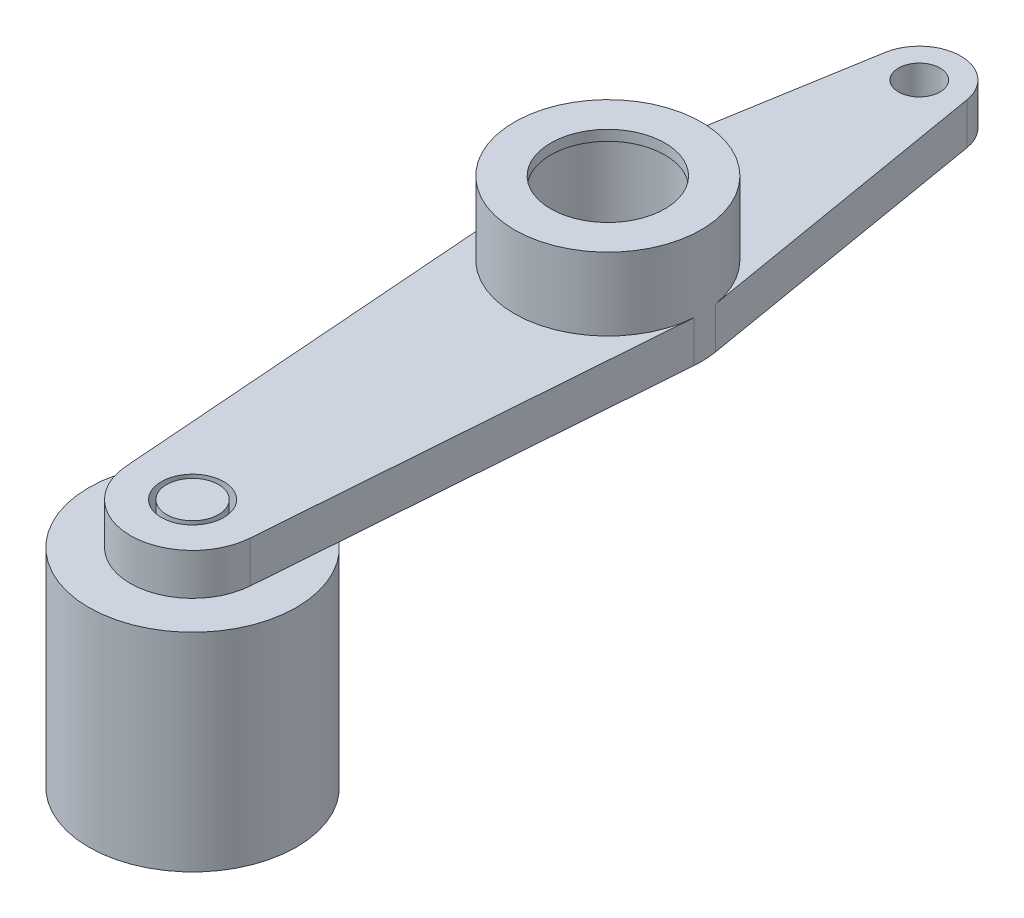
ISO-10303-21;
HEADER;
FILE_DESCRIPTION(('STEP AP214'),'2;1');
FILE_NAME('part.step','',(''),(''),'','','');
FILE_SCHEMA(('AUTOMOTIVE_DESIGN { 1 0 10303 214 1 1 1 1 }'));
ENDSEC;
DATA;
#1=APPLICATION_CONTEXT('core data for automotive mechanical design processes');
#2=APPLICATION_PROTOCOL_DEFINITION('international standard','automotive_design',2000,#1);
#3=PRODUCT_CONTEXT('',#1,'mechanical');
#4=PRODUCT('Part','Part','',(#3));
#5=PRODUCT_RELATED_PRODUCT_CATEGORY('part','',(#4));
#6=PRODUCT_DEFINITION_FORMATION('','',#4);
#7=PRODUCT_DEFINITION_CONTEXT('part definition',#1,'design');
#8=PRODUCT_DEFINITION('design','',#6,#7);
#9=PRODUCT_DEFINITION_SHAPE('','',#8);
#10=(LENGTH_UNIT() NAMED_UNIT(*) SI_UNIT(.MILLI.,.METRE.));
#11=(NAMED_UNIT(*) PLANE_ANGLE_UNIT() SI_UNIT($,.RADIAN.));
#12=(NAMED_UNIT(*) SI_UNIT($,.STERADIAN.) SOLID_ANGLE_UNIT());
#13=UNCERTAINTY_MEASURE_WITH_UNIT(LENGTH_MEASURE(1.E-05),#10,'distance_accuracy_value','');
#14=(GEOMETRIC_REPRESENTATION_CONTEXT(3) GLOBAL_UNCERTAINTY_ASSIGNED_CONTEXT((#13)) GLOBAL_UNIT_ASSIGNED_CONTEXT((#10,
#11,#12)) REPRESENTATION_CONTEXT('',''));
#15=CARTESIAN_POINT('',(0.,0.,0.));
#16=DIRECTION('',(0.,0.,1.));
#17=DIRECTION('',(1.,0.,0.));
#18=AXIS2_PLACEMENT_3D('',#15,#16,#17);
#19=CARTESIAN_POINT('',(0.,-43.1889152644782,74.1245546768149));
#20=DIRECTION('',(0.,-1.,0.));
#21=DIRECTION('',(0.,0.,-1.));
#22=AXIS2_PLACEMENT_3D('',#19,#20,#21);
#23=PLANE('',#22);
#24=CARTESIAN_POINT('',(0.,-43.1889152644782,74.1245546768149));
#25=DIRECTION('',(0.,-1.,0.));
#26=DIRECTION('',(0.,0.,-1.));
#27=AXIS2_PLACEMENT_3D('',#24,#25,#26);
#28=CIRCLE('',#27,20.);
#29=CARTESIAN_POINT('',(0.,-43.1889152644782,54.1245546768149));
#30=VERTEX_POINT('',#29);
#31=EDGE_CURVE('E217',#30,#30,#28,.T.);
#32=ORIENTED_EDGE('',*,*,#31,.T.);
#33=EDGE_LOOP('',(#32));
#34=FACE_BOUND('',#33,.T.);
#35=DIRECTION('',(1.,0.,0.));
#36=VECTOR('',#35,1.);
#37=CARTESIAN_POINT('',(-2.,-43.1889152644782,87.1245546768149));
#38=LINE('',#37,#36);
#39=CARTESIAN_POINT('',(-2.,-43.1889152644782,87.1245546768149));
#40=VERTEX_POINT('',#39);
#41=CARTESIAN_POINT('',(2.,-43.1889152644782,87.1245546768149));
#42=VERTEX_POINT('',#41);
#43=EDGE_CURVE('E185',#40,#42,#38,.T.);
#44=ORIENTED_EDGE('',*,*,#43,.F.);
#45=DIRECTION('',(0.,0.,-1.));
#46=VECTOR('',#45,1.);
#47=CARTESIAN_POINT('',(-2.,-43.1889152644782,88.1245546768149));
#48=LINE('',#47,#46);
#49=CARTESIAN_POINT('',(-2.,-43.1889152644782,88.1245546768149));
#50=VERTEX_POINT('',#49);
#51=EDGE_CURVE('E182',#50,#40,#48,.T.);
#52=ORIENTED_EDGE('',*,*,#51,.F.);
#53=DIRECTION('',(-1.,0.,0.));
#54=VECTOR('',#53,1.);
#55=CARTESIAN_POINT('',(-2.,-43.1889152644782,88.1245546768149));
#56=LINE('',#55,#54);
#57=CARTESIAN_POINT('',(2.,-43.1889152644782,88.1245546768149));
#58=VERTEX_POINT('',#57);
#59=EDGE_CURVE('E194',#58,#50,#56,.T.);
#60=ORIENTED_EDGE('',*,*,#59,.F.);
#61=DIRECTION('',(0.,0.,1.));
#62=VECTOR('',#61,1.);
#63=CARTESIAN_POINT('',(2.,-43.1889152644782,88.1245546768149));
#64=LINE('',#63,#62);
#65=EDGE_CURVE('E202',#42,#58,#64,.T.);
#66=ORIENTED_EDGE('',*,*,#65,.F.);
#67=EDGE_LOOP('',(#44,#52,#60,#66));
#68=FACE_BOUND('',#67,.T.);
#69=DIRECTION('',(1.,0.,0.));
#70=VECTOR('',#69,1.);
#71=CARTESIAN_POINT('',(-2.47248400224977,-43.1889152644782,60.3505596848063));
#72=LINE('',#71,#70);
#73=CARTESIAN_POINT('',(-2.47248400224977,-43.1889152644782,60.3505596848063));
#74=VERTEX_POINT('',#73);
#75=CARTESIAN_POINT('',(2.47248400224977,-43.1889152644782,60.3505596848063));
#76=VERTEX_POINT('',#75);
#77=EDGE_CURVE('E608',#74,#76,#72,.T.);
#78=ORIENTED_EDGE('',*,*,#77,.F.);
#79=DIRECTION('',(0.,0.,-1.));
#80=VECTOR('',#79,1.);
#81=CARTESIAN_POINT('',(-2.47248400224977,-43.1889152644782,61.1245546768149));
#82=LINE('',#81,#80);
#83=CARTESIAN_POINT('',(-2.47248400224977,-43.1889152644782,61.1245546768149));
#84=VERTEX_POINT('',#83);
#85=EDGE_CURVE('E180',#84,#74,#82,.T.);
#86=ORIENTED_EDGE('',*,*,#85,.F.);
#87=DIRECTION('',(-1.,0.,0.));
#88=VECTOR('',#87,1.);
#89=CARTESIAN_POINT('',(-2.47248400224977,-43.1889152644782,61.1245546768149));
#90=LINE('',#89,#88);
#91=CARTESIAN_POINT('',(2.47248400224977,-43.1889152644782,61.1245546768149));
#92=VERTEX_POINT('',#91);
#93=EDGE_CURVE('E176',#92,#84,#90,.T.);
#94=ORIENTED_EDGE('',*,*,#93,.F.);
#95=DIRECTION('',(0.,0.,1.));
#96=VECTOR('',#95,1.);
#97=CARTESIAN_POINT('',(2.47248400224977,-43.1889152644782,61.1245546768149));
#98=LINE('',#97,#96);
#99=EDGE_CURVE('E605',#76,#92,#98,.T.);
#100=ORIENTED_EDGE('',*,*,#99,.F.);
#101=EDGE_LOOP('',(#78,#86,#94,#100));
#102=FACE_BOUND('',#101,.T.);
#103=ADVANCED_FACE('F37',(#34,#68,#102),#23,.T.);
#104=CARTESIAN_POINT('',(0.,4.81108473552181,-5.87544532318511));
#105=DIRECTION('',(0.,1.,0.));
#106=DIRECTION('',(0.,0.,1.));
#107=AXIS2_PLACEMENT_3D('',#104,#105,#106);
#108=PLANE('',#107);
#109=CARTESIAN_POINT('',(-4.10903620293485E-13,4.81108473552181,-65.8754453231851));
#110=DIRECTION('',(0.,1.,0.));
#111=DIRECTION('',(0.,0.,1.));
#112=AXIS2_PLACEMENT_3D('',#109,#110,#111);
#113=CIRCLE('',#112,4.);
#114=CARTESIAN_POINT('',(-4.10903620293485E-13,4.81108473552181,-61.8754453231851));
#115=VERTEX_POINT('',#114);
#116=EDGE_CURVE('E220',#115,#115,#113,.T.);
#117=ORIENTED_EDGE('',*,*,#116,.F.);
#118=EDGE_LOOP('',(#117));
#119=FACE_BOUND('',#118,.T.);
#120=CARTESIAN_POINT('',(0.,4.81108473552181,-5.87544532318511));
#121=DIRECTION('',(0.,1.,0.));
#122=DIRECTION('',(0.,0.,1.));
#123=AXIS2_PLACEMENT_3D('',#120,#121,#122);
#124=CIRCLE('',#123,18.);
#125=CARTESIAN_POINT('',(17.7482393492989,4.81108473552181,-8.87544532318525));
#126=VERTEX_POINT('',#125);
#127=CARTESIAN_POINT('',(-17.7482393492989,4.81108473552181,-8.87544532318499));
#128=VERTEX_POINT('',#127);
#129=EDGE_CURVE('E292',#126,#128,#124,.T.);
#130=ORIENTED_EDGE('',*,*,#129,.F.);
#131=DIRECTION('',(-0.166666666666674,0.,-0.986013297183268));
#132=VECTOR('',#131,1.);
#133=CARTESIAN_POINT('',(7.88810637746573,4.81108473552181,-67.2087786565185));
#134=LINE('',#133,#132);
#135=CARTESIAN_POINT('',(7.88810637746573,4.81108473552181,-67.2087786565185));
#136=VERTEX_POINT('',#135);
#137=EDGE_CURVE('E247',#126,#136,#134,.T.);
#138=ORIENTED_EDGE('',*,*,#137,.T.);
#139=CARTESIAN_POINT('',(-4.11305260441205E-13,4.81108473552181,-65.8754453231851));
#140=DIRECTION('',(0.,1.,0.));
#141=DIRECTION('',(0.,0.,1.));
#142=AXIS2_PLACEMENT_3D('',#139,#140,#141);
#143=CIRCLE('',#142,8.);
#144=CARTESIAN_POINT('',(-7.88810637746657,4.81108473552181,-67.2087786565184));
#145=VERTEX_POINT('',#144);
#146=EDGE_CURVE('E244',#136,#145,#143,.T.);
#147=ORIENTED_EDGE('',*,*,#146,.T.);
#148=DIRECTION('',(-0.16666666666666,0.,0.986013297183271));
#149=VECTOR('',#148,1.);
#150=CARTESIAN_POINT('',(-17.7482393492989,4.81108473552181,-8.87544532318499));
#151=LINE('',#150,#149);
#152=EDGE_CURVE('E246',#145,#128,#151,.T.);
#153=ORIENTED_EDGE('',*,*,#152,.T.);
#154=EDGE_LOOP('',(#130,#138,#147,#153));
#155=FACE_BOUND('',#154,.T.);
#156=ADVANCED_FACE('F356',(#119,#155),#108,.T.);
#157=CARTESIAN_POINT('',(7.88810637746573,4.81108473552181,-67.2087786565185));
#158=DIRECTION('',(-0.986013297183268,0.,0.166666666666674));
#159=DIRECTION('',(0.166666666666674,0.,0.986013297183268));
#160=AXIS2_PLACEMENT_3D('',#157,#158,#159);
#161=PLANE('',#160);
#162=DIRECTION('',(-0.166666666666674,0.,-0.986013297183268));
#163=VECTOR('',#162,1.);
#164=CARTESIAN_POINT('',(7.88810637746573,-3.18891526447819,-67.2087786565185));
#165=LINE('',#164,#163);
#166=CARTESIAN_POINT('',(17.7482393492989,-3.18891526447819,-8.87544532318525));
#167=VERTEX_POINT('',#166);
#168=CARTESIAN_POINT('',(7.88810637746573,-3.18891526447819,-67.2087786565185));
#169=VERTEX_POINT('',#168);
#170=EDGE_CURVE('E254',#167,#169,#165,.T.);
#171=ORIENTED_EDGE('',*,*,#170,.T.);
#172=DIRECTION('',(0.,-1.,0.));
#173=VECTOR('',#172,1.);
#174=CARTESIAN_POINT('',(7.88810637746573,4.81108473552181,-67.2087786565185));
#175=LINE('',#174,#173);
#176=EDGE_CURVE('E282',#136,#169,#175,.T.);
#177=ORIENTED_EDGE('',*,*,#176,.F.);
#178=ORIENTED_EDGE('',*,*,#137,.F.);
#179=DIRECTION('',(0.,-1.,0.));
#180=VECTOR('',#179,1.);
#181=CARTESIAN_POINT('',(17.7482393492989,4.81108473552181,-8.87544532318525));
#182=LINE('',#181,#180);
#183=EDGE_CURVE('E286',#126,#167,#182,.T.);
#184=ORIENTED_EDGE('',*,*,#183,.T.);
#185=EDGE_LOOP('',(#171,#177,#178,#184));
#186=FACE_BOUND('',#185,.T.);
#187=ADVANCED_FACE('F39',(#186),#161,.F.);
#188=CARTESIAN_POINT('',(-4.11305260441205E-13,4.81108473552181,-65.8754453231851));
#189=DIRECTION('',(0.,-1.,0.));
#190=DIRECTION('',(0.,0.,-1.));
#191=AXIS2_PLACEMENT_3D('',#188,#189,#190);
#192=CYLINDRICAL_SURFACE('',#191,8.);
#193=CARTESIAN_POINT('',(-4.11305260441205E-13,-3.18891526447819,-65.8754453231851));
#194=DIRECTION('',(0.,1.,0.));
#195=DIRECTION('',(0.,0.,1.));
#196=AXIS2_PLACEMENT_3D('',#193,#194,#195);
#197=CIRCLE('',#196,8.);
#198=CARTESIAN_POINT('',(-7.88810637746657,-3.18891526447819,-67.2087786565184));
#199=VERTEX_POINT('',#198);
#200=EDGE_CURVE('E256',#169,#199,#197,.T.);
#201=ORIENTED_EDGE('',*,*,#200,.T.);
#202=DIRECTION('',(0.,-1.,0.));
#203=VECTOR('',#202,1.);
#204=CARTESIAN_POINT('',(-7.88810637746657,4.81108473552181,-67.2087786565184));
#205=LINE('',#204,#203);
#206=EDGE_CURVE('E279',#145,#199,#205,.T.);
#207=ORIENTED_EDGE('',*,*,#206,.F.);
#208=ORIENTED_EDGE('',*,*,#146,.F.);
#209=ORIENTED_EDGE('',*,*,#176,.T.);
#210=EDGE_LOOP('',(#201,#207,#208,#209));
#211=FACE_BOUND('',#210,.T.);
#212=ADVANCED_FACE('F411',(#211),#192,.T.);
#213=CARTESIAN_POINT('',(-17.7482393492989,4.81108473552181,-8.87544532318499));
#214=DIRECTION('',(0.986013297183271,0.,0.16666666666666));
#215=DIRECTION('',(0.16666666666666,0.,-0.986013297183271));
#216=AXIS2_PLACEMENT_3D('',#213,#214,#215);
#217=PLANE('',#216);
#218=DIRECTION('',(-0.16666666666666,0.,0.986013297183271));
#219=VECTOR('',#218,1.);
#220=CARTESIAN_POINT('',(-17.7482393492989,-3.18891526447819,-8.87544532318499));
#221=LINE('',#220,#219);
#222=CARTESIAN_POINT('',(-17.7482393492989,-3.18891526447819,-8.87544532318499));
#223=VERTEX_POINT('',#222);
#224=EDGE_CURVE('E258',#199,#223,#221,.T.);
#225=ORIENTED_EDGE('',*,*,#224,.T.);
#226=DIRECTION('',(0.,-1.,0.));
#227=VECTOR('',#226,1.);
#228=CARTESIAN_POINT('',(-17.7482393492989,4.81108473552181,-8.87544532318499));
#229=LINE('',#228,#227);
#230=EDGE_CURVE('E283',#128,#223,#229,.T.);
#231=ORIENTED_EDGE('',*,*,#230,.F.);
#232=ORIENTED_EDGE('',*,*,#152,.F.);
#233=ORIENTED_EDGE('',*,*,#206,.T.);
#234=EDGE_LOOP('',(#225,#231,#232,#233));
#235=FACE_BOUND('',#234,.T.);
#236=ADVANCED_FACE('F413',(#235),#217,.F.);
#237=CARTESIAN_POINT('',(0.,4.81108473552181,-5.87544532318511));
#238=DIRECTION('',(0.,-1.,0.));
#239=DIRECTION('',(0.,0.,-1.));
#240=AXIS2_PLACEMENT_3D('',#237,#238,#239);
#241=CYLINDRICAL_SURFACE('',#240,18.);
#242=CARTESIAN_POINT('',(0.,-3.18891526447819,-5.87544532318511));
#243=DIRECTION('',(0.,1.,0.));
#244=DIRECTION('',(0.,0.,1.));
#245=AXIS2_PLACEMENT_3D('',#242,#243,#244);
#246=CIRCLE('',#245,18.);
#247=CARTESIAN_POINT('',(-17.9493036076612,-3.18891526447819,-4.5254453231851));
#248=VERTEX_POINT('',#247);
#249=EDGE_CURVE('E260',#223,#248,#246,.T.);
#250=ORIENTED_EDGE('',*,*,#249,.T.);
#251=DIRECTION('',(0.,-1.,0.));
#252=VECTOR('',#251,1.);
#253=CARTESIAN_POINT('',(-17.9493036076612,4.81108473552181,-4.5254453231851));
#254=LINE('',#253,#252);
#255=CARTESIAN_POINT('',(-17.9493036076612,4.81108473552181,-4.5254453231851));
#256=VERTEX_POINT('',#255);
#257=EDGE_CURVE('E278',#256,#248,#254,.T.);
#258=ORIENTED_EDGE('',*,*,#257,.F.);
#259=CARTESIAN_POINT('',(17.9493036076612,4.81108473552181,-4.52544532318511));
#260=VERTEX_POINT('',#259);
#261=EDGE_CURVE('E296',#256,#260,#124,.T.);
#262=ORIENTED_EDGE('',*,*,#261,.T.);
#263=DIRECTION('',(0.,-1.,0.));
#264=VECTOR('',#263,1.);
#265=CARTESIAN_POINT('',(17.9493036076613,4.81108473552181,-4.5254453231851));
#266=LINE('',#265,#264);
#267=CARTESIAN_POINT('',(17.9493036076613,-3.18891526447819,-4.5254453231851));
#268=VERTEX_POINT('',#267);
#269=EDGE_CURVE('E275',#260,#268,#266,.T.);
#270=ORIENTED_EDGE('',*,*,#269,.T.);
#271=CARTESIAN_POINT('',(0.,-3.18891526447819,-5.87544532318511));
#272=DIRECTION('',(0.,1.,0.));
#273=DIRECTION('',(0.,0.,1.));
#274=AXIS2_PLACEMENT_3D('',#271,#272,#273);
#275=CIRCLE('',#274,18.);
#276=EDGE_CURVE('E243',#268,#167,#275,.T.);
#277=ORIENTED_EDGE('',*,*,#276,.T.);
#278=ORIENTED_EDGE('',*,*,#183,.F.);
#279=ORIENTED_EDGE('',*,*,#129,.T.);
#280=ORIENTED_EDGE('',*,*,#230,.T.);
#281=EDGE_LOOP('',(#250,#258,#262,#270,#277,#278,#279,#280));
#282=FACE_BOUND('',#281,.T.);
#283=CARTESIAN_POINT('',(0.,18.8110847355218,-5.87544532318511));
#284=DIRECTION('',(0.,1.,0.));
#285=DIRECTION('',(0.,0.,1.));
#286=AXIS2_PLACEMENT_3D('',#283,#284,#285);
#287=CIRCLE('',#286,18.);
#288=CARTESIAN_POINT('',(0.,18.8110847355218,12.1245546768149));
#289=VERTEX_POINT('',#288);
#290=EDGE_CURVE('E240',#289,#289,#287,.T.);
#291=ORIENTED_EDGE('',*,*,#290,.F.);
#292=EDGE_LOOP('',(#291));
#293=FACE_BOUND('',#292,.T.);
#294=ADVANCED_FACE('F395',(#282,#293),#241,.T.);
#295=CARTESIAN_POINT('',(-17.9493036076612,4.81108473552181,-4.5254453231851));
#296=DIRECTION('',(0.997183533758957,0.,-0.0750000000000002));
#297=DIRECTION('',(-0.0750000000000002,0.,-0.997183533758957));
#298=AXIS2_PLACEMENT_3D('',#295,#296,#297);
#299=PLANE('',#298);
#300=DIRECTION('',(0.0750000000000002,0.,0.997183533758956));
#301=VECTOR('',#300,1.);
#302=CARTESIAN_POINT('',(-17.9493036076612,-3.18891526447819,-4.5254453231851));
#303=LINE('',#302,#301);
#304=CARTESIAN_POINT('',(-13.1662024051075,-3.18891526447819,59.0696181366716));
#305=VERTEX_POINT('',#304);
#306=EDGE_CURVE('E263',#248,#305,#303,.T.);
#307=ORIENTED_EDGE('',*,*,#306,.T.);
#308=CARTESIAN_POINT('',(-11.9662024051075,-3.18891526447819,75.0245546768149));
#309=VERTEX_POINT('',#308);
#310=EDGE_CURVE('E262',#305,#309,#303,.T.);
#311=ORIENTED_EDGE('',*,*,#310,.T.);
#312=DIRECTION('',(0.,-1.,0.));
#313=VECTOR('',#312,1.);
#314=CARTESIAN_POINT('',(-11.9662024051075,4.81108473552181,75.0245546768149));
#315=LINE('',#314,#313);
#316=CARTESIAN_POINT('',(-11.9662024051075,4.81108473552181,75.0245546768149));
#317=VERTEX_POINT('',#316);
#318=EDGE_CURVE('E274',#317,#309,#315,.T.);
#319=ORIENTED_EDGE('',*,*,#318,.F.);
#320=DIRECTION('',(0.0750000000000002,0.,0.997183533758956));
#321=VECTOR('',#320,1.);
#322=CARTESIAN_POINT('',(-17.9493036076612,4.81108473552181,-4.5254453231851));
#323=LINE('',#322,#321);
#324=EDGE_CURVE('E251',#256,#317,#323,.T.);
#325=ORIENTED_EDGE('',*,*,#324,.F.);
#326=ORIENTED_EDGE('',*,*,#257,.T.);
#327=EDGE_LOOP('',(#307,#311,#319,#325,#326));
#328=FACE_BOUND('',#327,.T.);
#329=ADVANCED_FACE('F383',(#328),#299,.F.);
#330=CARTESIAN_POINT('',(0.,4.81108473552181,74.1245546768149));
#331=DIRECTION('',(0.,-1.,0.));
#332=DIRECTION('',(0.,0.,-1.));
#333=AXIS2_PLACEMENT_3D('',#330,#331,#332);
#334=CYLINDRICAL_SURFACE('',#333,12.);
#335=CARTESIAN_POINT('',(0.,-3.18891526447819,74.1245546768149));
#336=DIRECTION('',(0.,1.,0.));
#337=DIRECTION('',(0.,0.,1.));
#338=AXIS2_PLACEMENT_3D('',#335,#336,#337);
#339=CIRCLE('',#338,12.);
#340=CARTESIAN_POINT('',(11.9662024051075,-3.18891526447819,75.0245546768149));
#341=VERTEX_POINT('',#340);
#342=EDGE_CURVE('E266',#309,#341,#339,.T.);
#343=ORIENTED_EDGE('',*,*,#342,.T.);
#344=DIRECTION('',(0.,-1.,0.));
#345=VECTOR('',#344,1.);
#346=CARTESIAN_POINT('',(11.9662024051075,4.81108473552181,75.0245546768149));
#347=LINE('',#346,#345);
#348=CARTESIAN_POINT('',(11.9662024051075,4.81108473552181,75.0245546768149));
#349=VERTEX_POINT('',#348);
#350=EDGE_CURVE('E271',#349,#341,#347,.T.);
#351=ORIENTED_EDGE('',*,*,#350,.F.);
#352=CARTESIAN_POINT('',(0.,4.81108473552181,74.1245546768149));
#353=DIRECTION('',(0.,1.,0.));
#354=DIRECTION('',(0.,0.,1.));
#355=AXIS2_PLACEMENT_3D('',#352,#353,#354);
#356=CIRCLE('',#355,12.);
#357=EDGE_CURVE('E248',#317,#349,#356,.T.);
#358=ORIENTED_EDGE('',*,*,#357,.F.);
#359=ORIENTED_EDGE('',*,*,#318,.T.);
#360=EDGE_LOOP('',(#343,#351,#358,#359));
#361=FACE_BOUND('',#360,.T.);
#362=ADVANCED_FACE('F387',(#361),#334,.T.);
#363=CARTESIAN_POINT('',(17.9493036076613,4.81108473552181,-4.5254453231851));
#364=DIRECTION('',(-0.997183533758957,0.,-0.0749999999999999));
#365=DIRECTION('',(-0.0749999999999999,0.,0.997183533758957));
#366=AXIS2_PLACEMENT_3D('',#363,#364,#365);
#367=PLANE('',#366);
#368=DIRECTION('',(0.0749999999999999,0.,-0.997183533758956));
#369=VECTOR('',#368,1.);
#370=CARTESIAN_POINT('',(17.9493036076613,-3.18891526447819,-4.5254453231851));
#371=LINE('',#370,#369);
#372=CARTESIAN_POINT('',(13.1662024051075,-3.18891526447819,59.0696181366716));
#373=VERTEX_POINT('',#372);
#374=EDGE_CURVE('E269',#341,#373,#371,.T.);
#375=ORIENTED_EDGE('',*,*,#374,.T.);
#376=EDGE_CURVE('E268',#373,#268,#371,.T.);
#377=ORIENTED_EDGE('',*,*,#376,.T.);
#378=ORIENTED_EDGE('',*,*,#269,.F.);
#379=DIRECTION('',(0.0749999999999999,0.,-0.997183533758956));
#380=VECTOR('',#379,1.);
#381=CARTESIAN_POINT('',(17.9493036076613,4.81108473552181,-4.5254453231851));
#382=LINE('',#381,#380);
#383=EDGE_CURVE('E250',#349,#260,#382,.T.);
#384=ORIENTED_EDGE('',*,*,#383,.F.);
#385=ORIENTED_EDGE('',*,*,#350,.T.);
#386=EDGE_LOOP('',(#375,#377,#378,#384,#385));
#387=FACE_BOUND('',#386,.T.);
#388=ADVANCED_FACE('F425',(#387),#367,.F.);
#389=CARTESIAN_POINT('',(0.,4.81108473552181,74.1245546768149));
#390=DIRECTION('',(0.,1.,0.));
#391=DIRECTION('',(0.,0.,1.));
#392=AXIS2_PLACEMENT_3D('',#389,#390,#391);
#393=CIRCLE('',#392,6.);
#394=CARTESIAN_POINT('',(0.,4.81108473552181,80.1245546768149));
#395=VERTEX_POINT('',#394);
#396=EDGE_CURVE('E233',#395,#395,#393,.T.);
#397=ORIENTED_EDGE('',*,*,#396,.F.);
#398=EDGE_LOOP('',(#397));
#399=FACE_BOUND('',#398,.T.);
#400=ORIENTED_EDGE('',*,*,#261,.F.);
#401=ORIENTED_EDGE('',*,*,#324,.T.);
#402=ORIENTED_EDGE('',*,*,#357,.T.);
#403=ORIENTED_EDGE('',*,*,#383,.T.);
#404=EDGE_LOOP('',(#400,#401,#402,#403));
#405=FACE_BOUND('',#404,.T.);
#406=ADVANCED_FACE('F364',(#399,#405),#108,.T.);
#407=CARTESIAN_POINT('',(0.,-3.18891526447819,-5.87544532318511));
#408=DIRECTION('',(0.,1.,0.));
#409=DIRECTION('',(0.,0.,1.));
#410=AXIS2_PLACEMENT_3D('',#407,#408,#409);
#411=PLANE('',#410);
#412=CARTESIAN_POINT('',(0.,-3.18891526447819,74.1245546768149));
#413=DIRECTION('',(0.,-1.,0.));
#414=DIRECTION('',(0.,0.,-1.));
#415=AXIS2_PLACEMENT_3D('',#412,#413,#414);
#416=CIRCLE('',#415,20.);
#417=EDGE_CURVE('E45',#305,#373,#416,.T.);
#418=ORIENTED_EDGE('',*,*,#417,.F.);
#419=ORIENTED_EDGE('',*,*,#306,.F.);
#420=ORIENTED_EDGE('',*,*,#249,.F.);
#421=ORIENTED_EDGE('',*,*,#224,.F.);
#422=ORIENTED_EDGE('',*,*,#200,.F.);
#423=ORIENTED_EDGE('',*,*,#170,.F.);
#424=ORIENTED_EDGE('',*,*,#276,.F.);
#425=ORIENTED_EDGE('',*,*,#376,.F.);
#426=EDGE_LOOP('',(#418,#419,#420,#421,#422,#423,#424,#425));
#427=FACE_BOUND('',#426,.T.);
#428=CARTESIAN_POINT('',(-4.10903620293485E-13,-3.18891526447819,-65.8754453231851));
#429=DIRECTION('',(0.,1.,0.));
#430=DIRECTION('',(0.,0.,1.));
#431=AXIS2_PLACEMENT_3D('',#428,#429,#430);
#432=CIRCLE('',#431,4.);
#433=CARTESIAN_POINT('',(-4.10903620293485E-13,-3.18891526447819,-61.8754453231851));
#434=VERTEX_POINT('',#433);
#435=EDGE_CURVE('E225',#434,#434,#432,.T.);
#436=ORIENTED_EDGE('',*,*,#435,.T.);
#437=EDGE_LOOP('',(#436));
#438=FACE_BOUND('',#437,.T.);
#439=CARTESIAN_POINT('',(0.,-3.18891526447819,-5.87544532318511));
#440=DIRECTION('',(0.,-1.,0.));
#441=DIRECTION('',(0.,0.,-1.));
#442=AXIS2_PLACEMENT_3D('',#439,#440,#441);
#443=CIRCLE('',#442,12.);
#444=CARTESIAN_POINT('',(0.,-3.18891526447819,-17.8754453231851));
#445=VERTEX_POINT('',#444);
#446=EDGE_CURVE('E234',#445,#445,#443,.T.);
#447=ORIENTED_EDGE('',*,*,#446,.F.);
#448=EDGE_LOOP('',(#447));
#449=FACE_BOUND('',#448,.T.);
#450=ADVANCED_FACE('F333',(#427,#438,#449),#411,.F.);
#451=CARTESIAN_POINT('',(0.,18.8110847355218,-5.87544532318511));
#452=DIRECTION('',(0.,1.,0.));
#453=DIRECTION('',(0.,0.,1.));
#454=AXIS2_PLACEMENT_3D('',#451,#452,#453);
#455=PLANE('',#454);
#456=CARTESIAN_POINT('',(0.,18.8110847355218,-5.87544532318511));
#457=DIRECTION('',(0.,1.,0.));
#458=DIRECTION('',(0.,0.,1.));
#459=AXIS2_PLACEMENT_3D('',#456,#457,#458);
#460=CIRCLE('',#459,11.);
#461=CARTESIAN_POINT('',(0.,18.8110847355218,5.12455467681489));
#462=VERTEX_POINT('',#461);
#463=EDGE_CURVE('E226',#462,#462,#460,.T.);
#464=ORIENTED_EDGE('',*,*,#463,.F.);
#465=EDGE_LOOP('',(#464));
#466=FACE_BOUND('',#465,.T.);
#467=ORIENTED_EDGE('',*,*,#290,.T.);
#468=EDGE_LOOP('',(#467));
#469=FACE_BOUND('',#468,.T.);
#470=ADVANCED_FACE('F429',(#466,#469),#455,.T.);
#471=CARTESIAN_POINT('',(0.,-3.18896526447819,74.1245546768149));
#472=DIRECTION('',(0.,1.,0.));
#473=DIRECTION('',(0.,0.,1.));
#474=AXIS2_PLACEMENT_3D('',#471,#472,#473);
#475=CYLINDRICAL_SURFACE('',#474,6.);
#476=ORIENTED_EDGE('',*,*,#396,.T.);
#477=EDGE_LOOP('',(#476));
#478=FACE_BOUND('',#477,.T.);
#479=CARTESIAN_POINT('',(0.,-3.18891526447819,74.1245546768149));
#480=DIRECTION('',(0.,1.,0.));
#481=DIRECTION('',(0.,0.,1.));
#482=AXIS2_PLACEMENT_3D('',#479,#480,#481);
#483=CIRCLE('',#482,6.);
#484=CARTESIAN_POINT('',(0.,-3.18891526447819,80.1245546768149));
#485=VERTEX_POINT('',#484);
#486=EDGE_CURVE('E239',#485,#485,#483,.T.);
#487=ORIENTED_EDGE('',*,*,#486,.F.);
#488=EDGE_LOOP('',(#487));
#489=FACE_BOUND('',#488,.T.);
#490=ADVANCED_FACE('F435',(#478,#489),#475,.F.);
#491=CARTESIAN_POINT('',(0.,16.8110847355218,-5.87544532318511));
#492=DIRECTION('',(0.,-1.,0.));
#493=DIRECTION('',(0.,0.,-1.));
#494=AXIS2_PLACEMENT_3D('',#491,#492,#493);
#495=CYLINDRICAL_SURFACE('',#494,12.);
#496=CARTESIAN_POINT('',(0.,16.8110847355218,-5.87544532318511));
#497=DIRECTION('',(0.,-1.,0.));
#498=DIRECTION('',(0.,0.,-1.));
#499=AXIS2_PLACEMENT_3D('',#496,#497,#498);
#500=CIRCLE('',#499,12.);
#501=CARTESIAN_POINT('',(0.,16.8110847355218,-17.8754453231851));
#502=VERTEX_POINT('',#501);
#503=EDGE_CURVE('E230',#502,#502,#500,.T.);
#504=ORIENTED_EDGE('',*,*,#503,.F.);
#505=EDGE_LOOP('',(#504));
#506=FACE_BOUND('',#505,.T.);
#507=ORIENTED_EDGE('',*,*,#446,.T.);
#508=EDGE_LOOP('',(#507));
#509=FACE_BOUND('',#508,.T.);
#510=ADVANCED_FACE('F439',(#506,#509),#495,.F.);
#511=CARTESIAN_POINT('',(0.,16.8110847355218,-5.87544532318511));
#512=DIRECTION('',(0.,-1.,0.));
#513=DIRECTION('',(0.,0.,-1.));
#514=AXIS2_PLACEMENT_3D('',#511,#512,#513);
#515=PLANE('',#514);
#516=CARTESIAN_POINT('',(0.,16.8110847355218,-5.87544532318511));
#517=DIRECTION('',(0.,-1.,0.));
#518=DIRECTION('',(0.,0.,-1.));
#519=AXIS2_PLACEMENT_3D('',#516,#517,#518);
#520=CIRCLE('',#519,11.);
#521=CARTESIAN_POINT('',(0.,16.8110847355218,-16.8754453231851));
#522=VERTEX_POINT('',#521);
#523=EDGE_CURVE('E229',#522,#522,#520,.T.);
#524=ORIENTED_EDGE('',*,*,#523,.F.);
#525=EDGE_LOOP('',(#524));
#526=FACE_BOUND('',#525,.T.);
#527=ORIENTED_EDGE('',*,*,#503,.T.);
#528=EDGE_LOOP('',(#527));
#529=FACE_BOUND('',#528,.T.);
#530=ADVANCED_FACE('F351',(#526,#529),#515,.T.);
#531=CARTESIAN_POINT('',(0.,-3.18896526447819,-5.87544532318511));
#532=DIRECTION('',(0.,1.,0.));
#533=DIRECTION('',(0.,0.,1.));
#534=AXIS2_PLACEMENT_3D('',#531,#532,#533);
#535=CYLINDRICAL_SURFACE('',#534,11.);
#536=ORIENTED_EDGE('',*,*,#523,.T.);
#537=EDGE_LOOP('',(#536));
#538=FACE_BOUND('',#537,.T.);
#539=ORIENTED_EDGE('',*,*,#463,.T.);
#540=EDGE_LOOP('',(#539));
#541=FACE_BOUND('',#540,.T.);
#542=ADVANCED_FACE('F339',(#538,#541),#535,.F.);
#543=CARTESIAN_POINT('',(-4.10903620293485E-13,4.81108473552181,-65.8754453231851));
#544=DIRECTION('',(0.,1.,0.));
#545=DIRECTION('',(0.,0.,1.));
#546=AXIS2_PLACEMENT_3D('',#543,#544,#545);
#547=CYLINDRICAL_SURFACE('',#546,4.);
#548=ORIENTED_EDGE('',*,*,#116,.T.);
#549=EDGE_LOOP('',(#548));
#550=FACE_BOUND('',#549,.T.);
#551=ORIENTED_EDGE('',*,*,#435,.F.);
#552=EDGE_LOOP('',(#551));
#553=FACE_BOUND('',#552,.T.);
#554=ADVANCED_FACE('F336',(#550,#553),#547,.F.);
#555=CARTESIAN_POINT('',(0.,-3.18891526447819,74.1245546768149));
#556=DIRECTION('',(0.,-1.,0.));
#557=DIRECTION('',(0.,0.,-1.));
#558=AXIS2_PLACEMENT_3D('',#555,#556,#557);
#559=PLANE('',#558);
#560=ORIENTED_EDGE('',*,*,#374,.F.);
#561=ORIENTED_EDGE('',*,*,#342,.F.);
#562=ORIENTED_EDGE('',*,*,#310,.F.);
#563=EDGE_CURVE('E216',#373,#305,#416,.T.);
#564=ORIENTED_EDGE('',*,*,#563,.F.);
#565=EDGE_LOOP('',(#560,#561,#562,#564));
#566=FACE_BOUND('',#565,.T.);
#567=ADVANCED_FACE('F338',(#566),#559,.F.);
#568=CARTESIAN_POINT('',(0.,-43.1889152644782,74.1245546768149));
#569=DIRECTION('',(0.,1.,0.));
#570=DIRECTION('',(0.,0.,1.));
#571=AXIS2_PLACEMENT_3D('',#568,#569,#570);
#572=CYLINDRICAL_SURFACE('',#571,20.);
#573=ORIENTED_EDGE('',*,*,#31,.F.);
#574=EDGE_LOOP('',(#573));
#575=FACE_BOUND('',#574,.T.);
#576=ORIENTED_EDGE('',*,*,#563,.T.);
#577=ORIENTED_EDGE('',*,*,#417,.T.);
#578=EDGE_LOOP('',(#576,#577));
#579=FACE_BOUND('',#578,.T.);
#580=ADVANCED_FACE('F347',(#575,#579),#572,.T.);
#581=CARTESIAN_POINT('',(0.,-3.18891526447819,74.1245546768149));
#582=DIRECTION('',(0.,-1.,0.));
#583=DIRECTION('',(0.,0.,-1.));
#584=AXIS2_PLACEMENT_3D('',#581,#582,#583);
#585=CIRCLE('',#584,5.);
#586=CARTESIAN_POINT('',(0.,-3.18891526447819,69.1245546768149));
#587=VERTEX_POINT('',#586);
#588=EDGE_CURVE('E11',#587,#587,#585,.F.);
#589=ORIENTED_EDGE('',*,*,#588,.F.);
#590=EDGE_LOOP('',(#589));
#591=FACE_BOUND('',#590,.T.);
#592=ORIENTED_EDGE('',*,*,#486,.T.);
#593=EDGE_LOOP('',(#592));
#594=FACE_BOUND('',#593,.T.);
#595=ADVANCED_FACE('F350',(#591,#594),#559,.F.);
#596=CARTESIAN_POINT('',(0.,4.81108473552181,74.1245546768149));
#597=DIRECTION('',(0.,-1.,0.));
#598=DIRECTION('',(0.,0.,-1.));
#599=AXIS2_PLACEMENT_3D('',#596,#597,#598);
#600=CYLINDRICAL_SURFACE('',#599,5.);
#601=CARTESIAN_POINT('',(0.,4.81108473552181,74.1245546768149));
#602=DIRECTION('',(0.,1.,0.));
#603=DIRECTION('',(0.,0.,1.));
#604=AXIS2_PLACEMENT_3D('',#601,#602,#603);
#605=CIRCLE('',#604,5.);
#606=CARTESIAN_POINT('',(0.,4.81108473552181,79.1245546768149));
#607=VERTEX_POINT('',#606);
#608=EDGE_CURVE('E213',#607,#607,#605,.T.);
#609=ORIENTED_EDGE('',*,*,#608,.F.);
#610=EDGE_LOOP('',(#609));
#611=FACE_BOUND('',#610,.T.);
#612=ORIENTED_EDGE('',*,*,#588,.T.);
#613=EDGE_LOOP('',(#612));
#614=FACE_BOUND('',#613,.T.);
#615=ADVANCED_FACE('F367',(#611,#614),#600,.T.);
#616=CARTESIAN_POINT('',(0.,4.81108473552181,74.1245546768149));
#617=DIRECTION('',(0.,1.,0.));
#618=DIRECTION('',(0.,0.,1.));
#619=AXIS2_PLACEMENT_3D('',#616,#617,#618);
#620=PLANE('',#619);
#621=ORIENTED_EDGE('',*,*,#608,.T.);
#622=EDGE_LOOP('',(#621));
#623=FACE_BOUND('',#622,.T.);
#624=ADVANCED_FACE('F493',(#623),#620,.T.);
#625=CARTESIAN_POINT('',(-2.,-47.1889152644782,88.1245546768149));
#626=DIRECTION('',(1.,0.,0.));
#627=DIRECTION('',(0.,0.,-1.));
#628=AXIS2_PLACEMENT_3D('',#625,#626,#627);
#629=PLANE('',#628);
#630=ORIENTED_EDGE('',*,*,#51,.T.);
#631=DIRECTION('',(0.,1.,0.));
#632=VECTOR('',#631,1.);
#633=CARTESIAN_POINT('',(-2.,-47.1889152644782,87.1245546768149));
#634=LINE('',#633,#632);
#635=CARTESIAN_POINT('',(-2.,-47.1889152644782,87.1245546768149));
#636=VERTEX_POINT('',#635);
#637=EDGE_CURVE('E211',#636,#40,#634,.T.);
#638=ORIENTED_EDGE('',*,*,#637,.F.);
#639=DIRECTION('',(0.,0.,-1.));
#640=VECTOR('',#639,1.);
#641=CARTESIAN_POINT('',(-2.,-47.1889152644782,88.1245546768149));
#642=LINE('',#641,#640);
#643=CARTESIAN_POINT('',(-2.,-47.1889152644782,88.1245546768149));
#644=VERTEX_POINT('',#643);
#645=EDGE_CURVE('E190',#644,#636,#642,.T.);
#646=ORIENTED_EDGE('',*,*,#645,.F.);
#647=DIRECTION('',(0.,1.,0.));
#648=VECTOR('',#647,1.);
#649=CARTESIAN_POINT('',(-2.,-47.1889152644782,88.1245546768149));
#650=LINE('',#649,#648);
#651=EDGE_CURVE('E199',#644,#50,#650,.T.);
#652=ORIENTED_EDGE('',*,*,#651,.T.);
#653=EDGE_LOOP('',(#630,#638,#646,#652));
#654=FACE_BOUND('',#653,.T.);
#655=ADVANCED_FACE('F501',(#654),#629,.F.);
#656=CARTESIAN_POINT('',(-2.,-47.1889152644782,87.1245546768149));
#657=DIRECTION('',(0.,0.,1.));
#658=DIRECTION('',(1.,0.,0.));
#659=AXIS2_PLACEMENT_3D('',#656,#657,#658);
#660=PLANE('',#659);
#661=ORIENTED_EDGE('',*,*,#43,.T.);
#662=DIRECTION('',(0.,1.,0.));
#663=VECTOR('',#662,1.);
#664=CARTESIAN_POINT('',(2.,-47.1889152644782,87.1245546768149));
#665=LINE('',#664,#663);
#666=CARTESIAN_POINT('',(2.,-47.1889152644782,87.1245546768149));
#667=VERTEX_POINT('',#666);
#668=EDGE_CURVE('E208',#667,#42,#665,.T.);
#669=ORIENTED_EDGE('',*,*,#668,.F.);
#670=DIRECTION('',(1.,0.,0.));
#671=VECTOR('',#670,1.);
#672=CARTESIAN_POINT('',(-2.,-47.1889152644782,87.1245546768149));
#673=LINE('',#672,#671);
#674=EDGE_CURVE('E193',#636,#667,#673,.T.);
#675=ORIENTED_EDGE('',*,*,#674,.F.);
#676=ORIENTED_EDGE('',*,*,#637,.T.);
#677=EDGE_LOOP('',(#661,#669,#675,#676));
#678=FACE_BOUND('',#677,.T.);
#679=ADVANCED_FACE('F513',(#678),#660,.F.);
#680=CARTESIAN_POINT('',(2.,-47.1889152644782,88.1245546768149));
#681=DIRECTION('',(-1.,0.,0.));
#682=DIRECTION('',(0.,0.,1.));
#683=AXIS2_PLACEMENT_3D('',#680,#681,#682);
#684=PLANE('',#683);
#685=ORIENTED_EDGE('',*,*,#65,.T.);
#686=DIRECTION('',(0.,1.,0.));
#687=VECTOR('',#686,1.);
#688=CARTESIAN_POINT('',(2.,-47.1889152644782,88.1245546768149));
#689=LINE('',#688,#687);
#690=CARTESIAN_POINT('',(2.,-47.1889152644782,88.1245546768149));
#691=VERTEX_POINT('',#690);
#692=EDGE_CURVE('E60',#691,#58,#689,.T.);
#693=ORIENTED_EDGE('',*,*,#692,.F.);
#694=DIRECTION('',(0.,0.,1.));
#695=VECTOR('',#694,1.);
#696=CARTESIAN_POINT('',(2.,-47.1889152644782,88.1245546768149));
#697=LINE('',#696,#695);
#698=EDGE_CURVE('E196',#667,#691,#697,.T.);
#699=ORIENTED_EDGE('',*,*,#698,.F.);
#700=ORIENTED_EDGE('',*,*,#668,.T.);
#701=EDGE_LOOP('',(#685,#693,#699,#700));
#702=FACE_BOUND('',#701,.T.);
#703=ADVANCED_FACE('F522',(#702),#684,.F.);
#704=CARTESIAN_POINT('',(-2.,-47.1889152644782,88.1245546768149));
#705=DIRECTION('',(0.,0.,-1.));
#706=DIRECTION('',(-1.,0.,0.));
#707=AXIS2_PLACEMENT_3D('',#704,#705,#706);
#708=PLANE('',#707);
#709=ORIENTED_EDGE('',*,*,#59,.T.);
#710=ORIENTED_EDGE('',*,*,#651,.F.);
#711=DIRECTION('',(-1.,0.,0.));
#712=VECTOR('',#711,1.);
#713=CARTESIAN_POINT('',(-2.,-47.1889152644782,88.1245546768149));
#714=LINE('',#713,#712);
#715=EDGE_CURVE('E198',#691,#644,#714,.T.);
#716=ORIENTED_EDGE('',*,*,#715,.F.);
#717=ORIENTED_EDGE('',*,*,#692,.T.);
#718=EDGE_LOOP('',(#709,#710,#716,#717));
#719=FACE_BOUND('',#718,.T.);
#720=ADVANCED_FACE('F531',(#719),#708,.F.);
#721=CARTESIAN_POINT('',(0.,-47.1889152644782,0.));
#722=DIRECTION('',(0.,-1.,0.));
#723=DIRECTION('',(0.,0.,-1.));
#724=AXIS2_PLACEMENT_3D('',#721,#722,#723);
#725=PLANE('',#724);
#726=ORIENTED_EDGE('',*,*,#645,.T.);
#727=ORIENTED_EDGE('',*,*,#674,.T.);
#728=ORIENTED_EDGE('',*,*,#698,.T.);
#729=ORIENTED_EDGE('',*,*,#715,.T.);
#730=EDGE_LOOP('',(#726,#727,#728,#729));
#731=FACE_BOUND('',#730,.T.);
#732=ADVANCED_FACE('F540',(#731),#725,.T.);
#733=CARTESIAN_POINT('',(-2.47248400224977,-47.1889152644782,61.1245546768149));
#734=DIRECTION('',(1.,0.,0.));
#735=DIRECTION('',(0.,0.,-1.));
#736=AXIS2_PLACEMENT_3D('',#733,#734,#735);
#737=PLANE('',#736);
#738=ORIENTED_EDGE('',*,*,#85,.T.);
#739=DIRECTION('',(0.,1.,0.));
#740=VECTOR('',#739,1.);
#741=CARTESIAN_POINT('',(-2.47248400224977,-47.1889152644782,60.3505596848063));
#742=LINE('',#741,#740);
#743=CARTESIAN_POINT('',(-2.47248400224977,-47.1889152644782,60.3505596848063));
#744=VERTEX_POINT('',#743);
#745=EDGE_CURVE('E161',#744,#74,#742,.T.);
#746=ORIENTED_EDGE('',*,*,#745,.F.);
#747=DIRECTION('',(0.,0.,-1.));
#748=VECTOR('',#747,1.);
#749=CARTESIAN_POINT('',(-2.47248400224977,-47.1889152644782,61.1245546768149));
#750=LINE('',#749,#748);
#751=CARTESIAN_POINT('',(-2.47248400224977,-47.1889152644782,61.1245546768149));
#752=VERTEX_POINT('',#751);
#753=EDGE_CURVE('E168',#752,#744,#750,.T.);
#754=ORIENTED_EDGE('',*,*,#753,.F.);
#755=DIRECTION('',(0.,1.,0.));
#756=VECTOR('',#755,1.);
#757=CARTESIAN_POINT('',(-2.47248400224977,-47.1889152644782,61.1245546768149));
#758=LINE('',#757,#756);
#759=EDGE_CURVE('E602',#752,#84,#758,.T.);
#760=ORIENTED_EDGE('',*,*,#759,.T.);
#761=EDGE_LOOP('',(#738,#746,#754,#760));
#762=FACE_BOUND('',#761,.T.);
#763=ADVANCED_FACE('F178',(#762),#737,.F.);
#764=CARTESIAN_POINT('',(-2.47248400224977,-47.1889152644782,60.3505596848063));
#765=DIRECTION('',(0.,0.,1.));
#766=DIRECTION('',(1.,0.,0.));
#767=AXIS2_PLACEMENT_3D('',#764,#765,#766);
#768=PLANE('',#767);
#769=ORIENTED_EDGE('',*,*,#77,.T.);
#770=DIRECTION('',(0.,1.,0.));
#771=VECTOR('',#770,1.);
#772=CARTESIAN_POINT('',(2.47248400224977,-47.1889152644782,60.3505596848063));
#773=LINE('',#772,#771);
#774=CARTESIAN_POINT('',(2.47248400224977,-47.1889152644782,60.3505596848063));
#775=VERTEX_POINT('',#774);
#776=EDGE_CURVE('E164',#775,#76,#773,.T.);
#777=ORIENTED_EDGE('',*,*,#776,.F.);
#778=DIRECTION('',(1.,0.,0.));
#779=VECTOR('',#778,1.);
#780=CARTESIAN_POINT('',(-2.47248400224977,-47.1889152644782,60.3505596848063));
#781=LINE('',#780,#779);
#782=EDGE_CURVE('E157',#744,#775,#781,.T.);
#783=ORIENTED_EDGE('',*,*,#782,.F.);
#784=ORIENTED_EDGE('',*,*,#745,.T.);
#785=EDGE_LOOP('',(#769,#777,#783,#784));
#786=FACE_BOUND('',#785,.T.);
#787=ADVANCED_FACE('F159',(#786),#768,.F.);
#788=CARTESIAN_POINT('',(2.47248400224977,-47.1889152644782,61.1245546768149));
#789=DIRECTION('',(-1.,0.,0.));
#790=DIRECTION('',(0.,0.,1.));
#791=AXIS2_PLACEMENT_3D('',#788,#789,#790);
#792=PLANE('',#791);
#793=ORIENTED_EDGE('',*,*,#99,.T.);
#794=DIRECTION('',(0.,1.,0.));
#795=VECTOR('',#794,1.);
#796=CARTESIAN_POINT('',(2.47248400224977,-47.1889152644782,61.1245546768149));
#797=LINE('',#796,#795);
#798=CARTESIAN_POINT('',(2.47248400224977,-47.1889152644782,61.1245546768149));
#799=VERTEX_POINT('',#798);
#800=EDGE_CURVE('E52',#799,#92,#797,.T.);
#801=ORIENTED_EDGE('',*,*,#800,.F.);
#802=DIRECTION('',(0.,0.,1.));
#803=VECTOR('',#802,1.);
#804=CARTESIAN_POINT('',(2.47248400224977,-47.1889152644782,61.1245546768149));
#805=LINE('',#804,#803);
#806=EDGE_CURVE('E167',#775,#799,#805,.T.);
#807=ORIENTED_EDGE('',*,*,#806,.F.);
#808=ORIENTED_EDGE('',*,*,#776,.T.);
#809=EDGE_LOOP('',(#793,#801,#807,#808));
#810=FACE_BOUND('',#809,.T.);
#811=ADVANCED_FACE('F563',(#810),#792,.F.);
#812=CARTESIAN_POINT('',(-2.47248400224977,-47.1889152644782,61.1245546768149));
#813=DIRECTION('',(0.,0.,-1.));
#814=DIRECTION('',(-1.,0.,0.));
#815=AXIS2_PLACEMENT_3D('',#812,#813,#814);
#816=PLANE('',#815);
#817=ORIENTED_EDGE('',*,*,#93,.T.);
#818=ORIENTED_EDGE('',*,*,#759,.F.);
#819=DIRECTION('',(-1.,0.,0.));
#820=VECTOR('',#819,1.);
#821=CARTESIAN_POINT('',(-2.47248400224977,-47.1889152644782,61.1245546768149));
#822=LINE('',#821,#820);
#823=EDGE_CURVE('E172',#799,#752,#822,.T.);
#824=ORIENTED_EDGE('',*,*,#823,.F.);
#825=ORIENTED_EDGE('',*,*,#800,.T.);
#826=EDGE_LOOP('',(#817,#818,#824,#825));
#827=FACE_BOUND('',#826,.T.);
#828=ADVANCED_FACE('F571',(#827),#816,.F.);
#829=CARTESIAN_POINT('',(0.,-47.1889152644782,0.));
#830=DIRECTION('',(0.,-1.,0.));
#831=DIRECTION('',(0.,0.,-1.));
#832=AXIS2_PLACEMENT_3D('',#829,#830,#831);
#833=PLANE('',#832);
#834=ORIENTED_EDGE('',*,*,#753,.T.);
#835=ORIENTED_EDGE('',*,*,#782,.T.);
#836=ORIENTED_EDGE('',*,*,#806,.T.);
#837=ORIENTED_EDGE('',*,*,#823,.T.);
#838=EDGE_LOOP('',(#834,#835,#836,#837));
#839=FACE_BOUND('',#838,.T.);
#840=ADVANCED_FACE('F171',(#839),#833,.T.);
#841=CLOSED_SHELL('',(#103,#156,#187,#212,#236,#294,#329,#362,#388,#406,#450,#470,#490,#510,
#530,#542,#554,#567,#580,#595,#615,#624,#655,#679,#703,#720,#732,#763,#787,#811,#828,#840));
#842=MANIFOLD_SOLID_BREP('B2',#841);
#843=ADVANCED_BREP_SHAPE_REPRESENTATION('',(#18,#842),#14);
#844=SHAPE_DEFINITION_REPRESENTATION(#9,#843);
ENDSEC;
END-ISO-10303-21;
